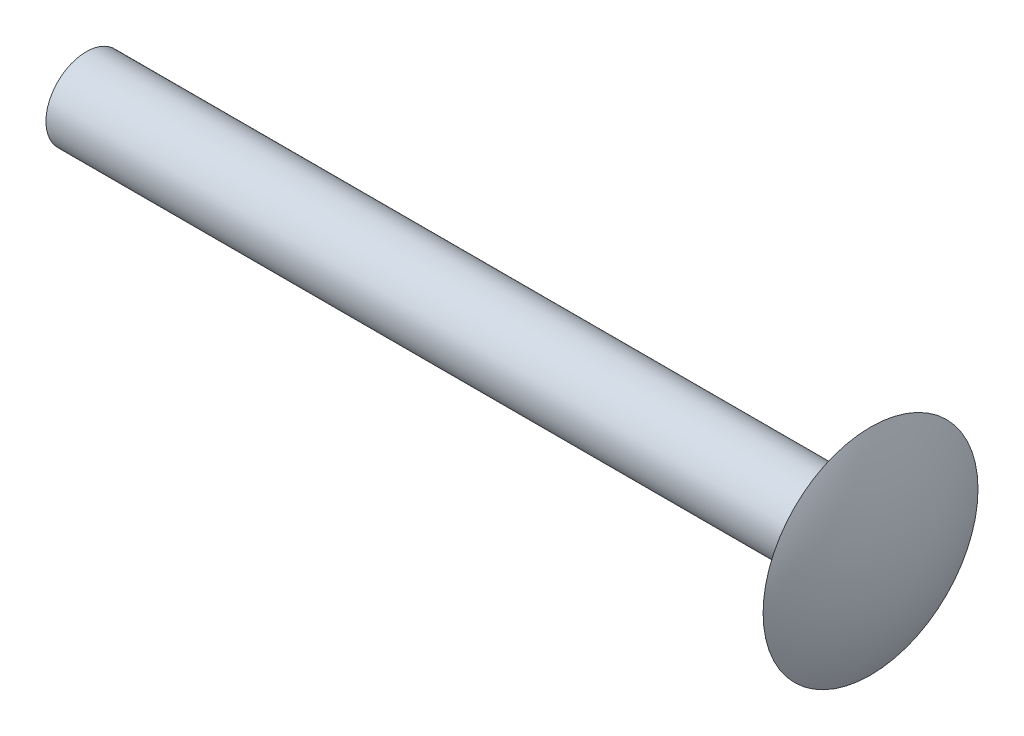
ISO-10303-21;
HEADER;
FILE_DESCRIPTION(('STEP AP214'),'2;1');
FILE_NAME('part.step','',(''),(''),'','','');
FILE_SCHEMA(('AUTOMOTIVE_DESIGN { 1 0 10303 214 1 1 1 1 }'));
ENDSEC;
DATA;
#1=APPLICATION_CONTEXT('core data for automotive mechanical design processes');
#2=APPLICATION_PROTOCOL_DEFINITION('international standard','automotive_design',2000,#1);
#3=PRODUCT_CONTEXT('',#1,'mechanical');
#4=PRODUCT('Part','Part','',(#3));
#5=PRODUCT_RELATED_PRODUCT_CATEGORY('part','',(#4));
#6=PRODUCT_DEFINITION_FORMATION('','',#4);
#7=PRODUCT_DEFINITION_CONTEXT('part definition',#1,'design');
#8=PRODUCT_DEFINITION('design','',#6,#7);
#9=PRODUCT_DEFINITION_SHAPE('','',#8);
#10=(LENGTH_UNIT() NAMED_UNIT(*) SI_UNIT(.MILLI.,.METRE.));
#11=(NAMED_UNIT(*) PLANE_ANGLE_UNIT() SI_UNIT($,.RADIAN.));
#12=(NAMED_UNIT(*) SI_UNIT($,.STERADIAN.) SOLID_ANGLE_UNIT());
#13=UNCERTAINTY_MEASURE_WITH_UNIT(LENGTH_MEASURE(1.E-05),#10,'distance_accuracy_value','');
#14=(GEOMETRIC_REPRESENTATION_CONTEXT(3) GLOBAL_UNCERTAINTY_ASSIGNED_CONTEXT((#13)) GLOBAL_UNIT_ASSIGNED_CONTEXT((#10,
#11,#12)) REPRESENTATION_CONTEXT('',''));
#15=CARTESIAN_POINT('',(0.,0.,0.));
#16=DIRECTION('',(0.,0.,1.));
#17=DIRECTION('',(1.,0.,0.));
#18=AXIS2_PLACEMENT_3D('',#15,#16,#17);
#19=CARTESIAN_POINT('',(146.,0.,0.));
#20=DIRECTION('',(-1.,0.,0.));
#21=DIRECTION('',(0.,0.,1.));
#22=AXIS2_PLACEMENT_3D('',#19,#20,#21);
#23=CYLINDRICAL_SURFACE('',#22,7.5);
#24=CARTESIAN_POINT('',(146.,0.,0.));
#25=DIRECTION('',(1.,0.,0.));
#26=DIRECTION('',(0.,0.,-1.));
#27=AXIS2_PLACEMENT_3D('',#24,#25,#26);
#28=CIRCLE('',#27,7.5);
#29=CARTESIAN_POINT('',(146.,0.,-7.5));
#30=VERTEX_POINT('',#29);
#31=EDGE_CURVE('E10',#30,#30,#28,.T.);
#32=ORIENTED_EDGE('',*,*,#31,.F.);
#33=EDGE_LOOP('',(#32));
#34=FACE_BOUND('',#33,.T.);
#35=CARTESIAN_POINT('',(0.,0.,0.));
#36=DIRECTION('',(1.,0.,0.));
#37=DIRECTION('',(0.,0.,-1.));
#38=AXIS2_PLACEMENT_3D('',#35,#36,#37);
#39=CIRCLE('',#38,7.5);
#40=CARTESIAN_POINT('',(0.,0.,-7.5));
#41=VERTEX_POINT('',#40);
#42=EDGE_CURVE('E35',#41,#41,#39,.T.);
#43=ORIENTED_EDGE('',*,*,#42,.T.);
#44=EDGE_LOOP('',(#43));
#45=FACE_BOUND('',#44,.T.);
#46=ADVANCED_FACE('F32',(#34,#45),#23,.T.);
#47=CARTESIAN_POINT('',(0.,0.,0.));
#48=DIRECTION('',(1.,0.,0.));
#49=DIRECTION('',(0.,0.,-1.));
#50=AXIS2_PLACEMENT_3D('',#47,#48,#49);
#51=PLANE('',#50);
#52=ORIENTED_EDGE('',*,*,#42,.F.);
#53=EDGE_LOOP('',(#52));
#54=FACE_BOUND('',#53,.T.);
#55=ADVANCED_FACE('F55',(#54),#51,.F.);
#56=CARTESIAN_POINT('',(108.5,0.,0.));
#57=DIRECTION('',(1.,0.,0.));
#58=DIRECTION('',(0.,-1.,0.));
#59=AXIS2_PLACEMENT_3D('',#56,#57,#58);
#60=SPHERICAL_SURFACE('',#59,42.5);
#61=CARTESIAN_POINT('',(146.,0.,0.));
#62=DIRECTION('',(1.,0.,0.));
#63=DIRECTION('',(0.,1.,0.));
#64=AXIS2_PLACEMENT_3D('',#61,#62,#63);
#65=CIRCLE('',#64,20.);
#66=CARTESIAN_POINT('',(146.,20.,0.));
#67=VERTEX_POINT('',#66);
#68=EDGE_CURVE('E42',#67,#67,#65,.T.);
#69=ORIENTED_EDGE('',*,*,#68,.T.);
#70=EDGE_LOOP('',(#69));
#71=FACE_BOUND('',#70,.T.);
#72=ADVANCED_FACE('F47',(#71),#60,.T.);
#73=CARTESIAN_POINT('',(146.,0.,0.));
#74=DIRECTION('',(-1.,0.,0.));
#75=DIRECTION('',(0.,-1.,0.));
#76=AXIS2_PLACEMENT_3D('',#73,#74,#75);
#77=PLANE('',#76);
#78=ORIENTED_EDGE('',*,*,#31,.T.);
#79=EDGE_LOOP('',(#78));
#80=FACE_BOUND('',#79,.T.);
#81=ORIENTED_EDGE('',*,*,#68,.F.);
#82=EDGE_LOOP('',(#81));
#83=FACE_BOUND('',#82,.T.);
#84=ADVANCED_FACE('F49',(#80,#83),#77,.T.);
#85=CLOSED_SHELL('',(#46,#55,#72,#84));
#86=MANIFOLD_SOLID_BREP('B2',#85);
#87=ADVANCED_BREP_SHAPE_REPRESENTATION('',(#18,#86),#14);
#88=SHAPE_DEFINITION_REPRESENTATION(#9,#87);
ENDSEC;
END-ISO-10303-21;
